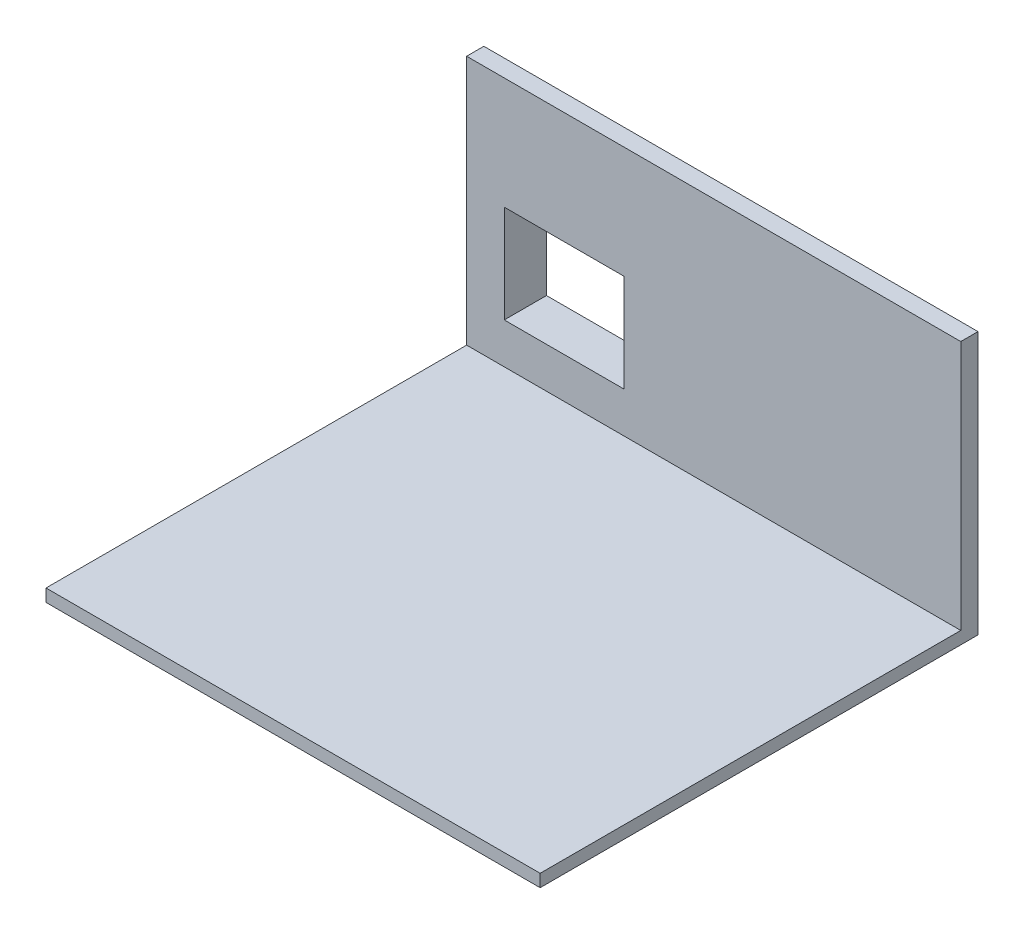
ISO-10303-21;
HEADER;
FILE_DESCRIPTION(('STEP AP214'),'2;1');
FILE_NAME('part.step','',(''),(''),'','','');
FILE_SCHEMA(('AUTOMOTIVE_DESIGN { 1 0 10303 214 1 1 1 1 }'));
ENDSEC;
DATA;
#1=APPLICATION_CONTEXT('core data for automotive mechanical design processes');
#2=APPLICATION_PROTOCOL_DEFINITION('international standard','automotive_design',2000,#1);
#3=PRODUCT_CONTEXT('',#1,'mechanical');
#4=PRODUCT('Part','Part','',(#3));
#5=PRODUCT_RELATED_PRODUCT_CATEGORY('part','',(#4));
#6=PRODUCT_DEFINITION_FORMATION('','',#4);
#7=PRODUCT_DEFINITION_CONTEXT('part definition',#1,'design');
#8=PRODUCT_DEFINITION('design','',#6,#7);
#9=PRODUCT_DEFINITION_SHAPE('','',#8);
#10=(LENGTH_UNIT() NAMED_UNIT(*) SI_UNIT(.MILLI.,.METRE.));
#11=(NAMED_UNIT(*) PLANE_ANGLE_UNIT() SI_UNIT($,.RADIAN.));
#12=(NAMED_UNIT(*) SI_UNIT($,.STERADIAN.) SOLID_ANGLE_UNIT());
#13=UNCERTAINTY_MEASURE_WITH_UNIT(LENGTH_MEASURE(1.E-05),#10,'distance_accuracy_value','');
#14=(GEOMETRIC_REPRESENTATION_CONTEXT(3) GLOBAL_UNCERTAINTY_ASSIGNED_CONTEXT((#13)) GLOBAL_UNIT_ASSIGNED_CONTEXT((#10,
#11,#12)) REPRESENTATION_CONTEXT('',''));
#15=CARTESIAN_POINT('',(0.,0.,0.));
#16=DIRECTION('',(0.,0.,1.));
#17=DIRECTION('',(1.,0.,0.));
#18=AXIS2_PLACEMENT_3D('',#15,#16,#17);
#19=CARTESIAN_POINT('',(0.,2100.,0.));
#20=DIRECTION('',(0.,1.,0.));
#21=DIRECTION('',(0.,0.,1.));
#22=AXIS2_PLACEMENT_3D('',#19,#20,#21);
#23=PLANE('',#22);
#24=DIRECTION('',(0.,0.,1.));
#25=VECTOR('',#24,1.);
#26=CARTESIAN_POINT('',(-6250.,2100.,-1760.86956521739));
#27=LINE('',#26,#25);
#28=CARTESIAN_POINT('',(-6250.,2100.,-1760.86956521739));
#29=VERTEX_POINT('',#28);
#30=CARTESIAN_POINT('',(-6250.,2100.,-1623.17873582494));
#31=VERTEX_POINT('',#30);
#32=EDGE_CURVE('E143',#29,#31,#27,.T.);
#33=ORIENTED_EDGE('',*,*,#32,.T.);
#34=DIRECTION('',(-1.,0.,0.));
#35=VECTOR('',#34,1.);
#36=CARTESIAN_POINT('',(-6250.,2100.,-1623.17873582494));
#37=LINE('',#36,#35);
#38=CARTESIAN_POINT('',(-2300.,2100.,-1623.17873582494));
#39=VERTEX_POINT('',#38);
#40=EDGE_CURVE('E137',#39,#31,#37,.T.);
#41=ORIENTED_EDGE('',*,*,#40,.F.);
#42=DIRECTION('',(0.,0.,1.));
#43=VECTOR('',#42,1.);
#44=CARTESIAN_POINT('',(-2300.,2100.,0.));
#45=LINE('',#44,#43);
#46=CARTESIAN_POINT('',(-2300.,2100.,-1760.86956521739));
#47=VERTEX_POINT('',#46);
#48=EDGE_CURVE('E141',#47,#39,#45,.T.);
#49=ORIENTED_EDGE('',*,*,#48,.F.);
#50=DIRECTION('',(-1.,0.,0.));
#51=VECTOR('',#50,1.);
#52=CARTESIAN_POINT('',(-6250.,2100.,-1760.86956521739));
#53=LINE('',#52,#51);
#54=EDGE_CURVE('E222',#47,#29,#53,.T.);
#55=ORIENTED_EDGE('',*,*,#54,.T.);
#56=EDGE_LOOP('',(#33,#41,#49,#55));
#57=FACE_BOUND('',#56,.T.);
#58=ADVANCED_FACE('F35',(#57),#23,.T.);
#59=CARTESIAN_POINT('',(-6250.,100.,-1760.86956521739));
#60=DIRECTION('',(0.,0.,1.));
#61=DIRECTION('',(1.,0.,0.));
#62=AXIS2_PLACEMENT_3D('',#59,#60,#61);
#63=PLANE('',#62);
#64=DIRECTION('',(-1.,0.,0.));
#65=VECTOR('',#64,1.);
#66=CARTESIAN_POINT('',(-6250.,0.,-1760.86956521739));
#67=LINE('',#66,#65);
#68=CARTESIAN_POINT('',(-2300.,0.,-1760.86956521739));
#69=VERTEX_POINT('',#68);
#70=CARTESIAN_POINT('',(-6250.,0.,-1760.86956521739));
#71=VERTEX_POINT('',#70);
#72=EDGE_CURVE('E228',#69,#71,#67,.T.);
#73=ORIENTED_EDGE('',*,*,#72,.T.);
#74=DIRECTION('',(0.,-1.,0.));
#75=VECTOR('',#74,1.);
#76=CARTESIAN_POINT('',(-6250.,100.,-1760.86956521739));
#77=LINE('',#76,#75);
#78=EDGE_CURVE('E230',#29,#71,#77,.T.);
#79=ORIENTED_EDGE('',*,*,#78,.F.);
#80=ORIENTED_EDGE('',*,*,#54,.F.);
#81=DIRECTION('',(0.,1.,0.));
#82=VECTOR('',#81,1.);
#83=CARTESIAN_POINT('',(-2300.,0.,-1760.86956521739));
#84=LINE('',#83,#82);
#85=EDGE_CURVE('E163',#69,#47,#84,.T.);
#86=ORIENTED_EDGE('',*,*,#85,.F.);
#87=EDGE_LOOP('',(#73,#79,#80,#86));
#88=FACE_BOUND('',#87,.T.);
#89=DIRECTION('',(0.,-1.,0.));
#90=VECTOR('',#89,1.);
#91=CARTESIAN_POINT('',(-4902.7095831107,1295.69578269687,-1760.86956521739));
#92=LINE('',#91,#90);
#93=CARTESIAN_POINT('',(-4902.7095831107,1295.69578269687,-1760.86956521739));
#94=VERTEX_POINT('',#93);
#95=CARTESIAN_POINT('',(-4902.7095831107,334.813684662396,-1760.86956521739));
#96=VERTEX_POINT('',#95);
#97=EDGE_CURVE('E191',#94,#96,#92,.T.);
#98=ORIENTED_EDGE('',*,*,#97,.F.);
#99=DIRECTION('',(1.,0.,0.));
#100=VECTOR('',#99,1.);
#101=CARTESIAN_POINT('',(-4902.7095831107,1295.69578269687,-1760.86956521739));
#102=LINE('',#101,#100);
#103=CARTESIAN_POINT('',(-6039.24135823389,1295.69578269687,-1760.86956521739));
#104=VERTEX_POINT('',#103);
#105=EDGE_CURVE('E196',#104,#94,#102,.T.);
#106=ORIENTED_EDGE('',*,*,#105,.F.);
#107=DIRECTION('',(0.,1.,0.));
#108=VECTOR('',#107,1.);
#109=CARTESIAN_POINT('',(-6039.24135823389,1295.69578269687,-1760.86956521739));
#110=LINE('',#109,#108);
#111=CARTESIAN_POINT('',(-6039.24135823389,334.813684662396,-1760.86956521739));
#112=VERTEX_POINT('',#111);
#113=EDGE_CURVE('E206',#112,#104,#110,.T.);
#114=ORIENTED_EDGE('',*,*,#113,.F.);
#115=DIRECTION('',(-1.,0.,0.));
#116=VECTOR('',#115,1.);
#117=CARTESIAN_POINT('',(-4902.7095831107,334.813684662396,-1760.86956521739));
#118=LINE('',#117,#116);
#119=EDGE_CURVE('E58',#96,#112,#118,.T.);
#120=ORIENTED_EDGE('',*,*,#119,.F.);
#121=EDGE_LOOP('',(#98,#106,#114,#120));
#122=FACE_BOUND('',#121,.T.);
#123=ADVANCED_FACE('F275',(#88,#122),#63,.F.);
#124=CARTESIAN_POINT('',(-6250.,100.,-1760.86956521739));
#125=DIRECTION('',(1.,0.,0.));
#126=DIRECTION('',(0.,0.,-1.));
#127=AXIS2_PLACEMENT_3D('',#124,#125,#126);
#128=PLANE('',#127);
#129=DIRECTION('',(0.,0.,1.));
#130=VECTOR('',#129,1.);
#131=CARTESIAN_POINT('',(-6250.,100.,-1760.86956521739));
#132=LINE('',#131,#130);
#133=CARTESIAN_POINT('',(-6250.,100.,-1623.17873582494));
#134=VERTEX_POINT('',#133);
#135=CARTESIAN_POINT('',(-6250.,100.,1739.13043478261));
#136=VERTEX_POINT('',#135);
#137=EDGE_CURVE('E225',#134,#136,#132,.T.);
#138=ORIENTED_EDGE('',*,*,#137,.F.);
#139=DIRECTION('',(0.,-1.,0.));
#140=VECTOR('',#139,1.);
#141=CARTESIAN_POINT('',(-6250.,2100.,-1623.17873582494));
#142=LINE('',#141,#140);
#143=EDGE_CURVE('E173',#31,#134,#142,.T.);
#144=ORIENTED_EDGE('',*,*,#143,.F.);
#145=ORIENTED_EDGE('',*,*,#32,.F.);
#146=ORIENTED_EDGE('',*,*,#78,.T.);
#147=DIRECTION('',(0.,0.,1.));
#148=VECTOR('',#147,1.);
#149=CARTESIAN_POINT('',(-6250.,0.,-1760.86956521739));
#150=LINE('',#149,#148);
#151=CARTESIAN_POINT('',(-6250.,0.,1739.13043478261));
#152=VERTEX_POINT('',#151);
#153=EDGE_CURVE('E224',#71,#152,#150,.T.);
#154=ORIENTED_EDGE('',*,*,#153,.T.);
#155=DIRECTION('',(0.,-1.,0.));
#156=VECTOR('',#155,1.);
#157=CARTESIAN_POINT('',(-6250.,100.,1739.13043478261));
#158=LINE('',#157,#156);
#159=EDGE_CURVE('E238',#136,#152,#158,.T.);
#160=ORIENTED_EDGE('',*,*,#159,.F.);
#161=EDGE_LOOP('',(#138,#144,#145,#146,#154,#160));
#162=FACE_BOUND('',#161,.T.);
#163=ADVANCED_FACE('F37',(#162),#128,.F.);
#164=CARTESIAN_POINT('',(-6250.,100.,1739.13043478261));
#165=DIRECTION('',(0.,0.,-1.));
#166=DIRECTION('',(-1.,0.,0.));
#167=AXIS2_PLACEMENT_3D('',#164,#165,#166);
#168=PLANE('',#167);
#169=DIRECTION('',(1.,0.,0.));
#170=VECTOR('',#169,1.);
#171=CARTESIAN_POINT('',(-6250.,0.,1739.13043478261));
#172=LINE('',#171,#170);
#173=CARTESIAN_POINT('',(-2300.,0.,1739.13043478261));
#174=VERTEX_POINT('',#173);
#175=EDGE_CURVE('E233',#152,#174,#172,.T.);
#176=ORIENTED_EDGE('',*,*,#175,.T.);
#177=DIRECTION('',(0.,-1.,0.));
#178=VECTOR('',#177,1.);
#179=CARTESIAN_POINT('',(-2300.,0.,1739.13043478261));
#180=LINE('',#179,#178);
#181=CARTESIAN_POINT('',(-2300.,100.,1739.13043478261));
#182=VERTEX_POINT('',#181);
#183=EDGE_CURVE('E167',#182,#174,#180,.T.);
#184=ORIENTED_EDGE('',*,*,#183,.F.);
#185=DIRECTION('',(1.,0.,0.));
#186=VECTOR('',#185,1.);
#187=CARTESIAN_POINT('',(-6250.,100.,1739.13043478261));
#188=LINE('',#187,#186);
#189=EDGE_CURVE('E227',#136,#182,#188,.T.);
#190=ORIENTED_EDGE('',*,*,#189,.F.);
#191=ORIENTED_EDGE('',*,*,#159,.T.);
#192=EDGE_LOOP('',(#176,#184,#190,#191));
#193=FACE_BOUND('',#192,.T.);
#194=ADVANCED_FACE('F291',(#193),#168,.F.);
#195=CARTESIAN_POINT('',(0.,100.,0.));
#196=DIRECTION('',(0.,1.,0.));
#197=DIRECTION('',(0.,0.,1.));
#198=AXIS2_PLACEMENT_3D('',#195,#196,#197);
#199=PLANE('',#198);
#200=ORIENTED_EDGE('',*,*,#189,.T.);
#201=DIRECTION('',(0.,0.,1.));
#202=VECTOR('',#201,1.);
#203=CARTESIAN_POINT('',(-2300.,100.,0.));
#204=LINE('',#203,#202);
#205=CARTESIAN_POINT('',(-2300.,100.,-1623.17873582494));
#206=VERTEX_POINT('',#205);
#207=EDGE_CURVE('E157',#206,#182,#204,.T.);
#208=ORIENTED_EDGE('',*,*,#207,.F.);
#209=DIRECTION('',(1.,0.,0.));
#210=VECTOR('',#209,1.);
#211=CARTESIAN_POINT('',(-6250.,100.,-1623.17873582494));
#212=LINE('',#211,#210);
#213=EDGE_CURVE('E148',#134,#206,#212,.T.);
#214=ORIENTED_EDGE('',*,*,#213,.F.);
#215=ORIENTED_EDGE('',*,*,#137,.T.);
#216=EDGE_LOOP('',(#200,#208,#214,#215));
#217=FACE_BOUND('',#216,.T.);
#218=ADVANCED_FACE('F287',(#217),#199,.T.);
#219=CARTESIAN_POINT('',(0.,0.,0.));
#220=DIRECTION('',(0.,1.,0.));
#221=DIRECTION('',(0.,0.,1.));
#222=AXIS2_PLACEMENT_3D('',#219,#220,#221);
#223=PLANE('',#222);
#224=ORIENTED_EDGE('',*,*,#153,.F.);
#225=ORIENTED_EDGE('',*,*,#72,.F.);
#226=DIRECTION('',(0.,0.,-1.));
#227=VECTOR('',#226,1.);
#228=CARTESIAN_POINT('',(-2300.,0.,0.));
#229=LINE('',#228,#227);
#230=EDGE_CURVE('E170',#174,#69,#229,.T.);
#231=ORIENTED_EDGE('',*,*,#230,.F.);
#232=ORIENTED_EDGE('',*,*,#175,.F.);
#233=EDGE_LOOP('',(#224,#225,#231,#232));
#234=FACE_BOUND('',#233,.T.);
#235=ADVANCED_FACE('F290',(#234),#223,.F.);
#236=CARTESIAN_POINT('',(0.,0.,-1960.86956521739));
#237=DIRECTION('',(0.,0.,-1.));
#238=DIRECTION('',(-1.,0.,0.));
#239=AXIS2_PLACEMENT_3D('',#236,#237,#238);
#240=PLANE('',#239);
#241=DIRECTION('',(0.,-1.,0.));
#242=VECTOR('',#241,1.);
#243=CARTESIAN_POINT('',(-4902.7095831107,1295.69578269687,-1960.86956521739));
#244=LINE('',#243,#242);
#245=CARTESIAN_POINT('',(-4902.7095831107,1295.69578269687,-1960.86956521739));
#246=VERTEX_POINT('',#245);
#247=CARTESIAN_POINT('',(-4902.7095831107,334.813684662396,-1960.86956521739));
#248=VERTEX_POINT('',#247);
#249=EDGE_CURVE('E192',#246,#248,#244,.T.);
#250=ORIENTED_EDGE('',*,*,#249,.T.);
#251=DIRECTION('',(-1.,0.,0.));
#252=VECTOR('',#251,1.);
#253=CARTESIAN_POINT('',(-4902.7095831107,334.813684662396,-1960.86956521739));
#254=LINE('',#253,#252);
#255=CARTESIAN_POINT('',(-6039.24135823389,334.813684662396,-1960.86956521739));
#256=VERTEX_POINT('',#255);
#257=EDGE_CURVE('E195',#248,#256,#254,.T.);
#258=ORIENTED_EDGE('',*,*,#257,.T.);
#259=DIRECTION('',(0.,1.,0.));
#260=VECTOR('',#259,1.);
#261=CARTESIAN_POINT('',(-6039.24135823389,1295.69578269687,-1960.86956521739));
#262=LINE('',#261,#260);
#263=CARTESIAN_POINT('',(-6039.24135823389,1295.69578269687,-1960.86956521739));
#264=VERTEX_POINT('',#263);
#265=EDGE_CURVE('E198',#256,#264,#262,.T.);
#266=ORIENTED_EDGE('',*,*,#265,.T.);
#267=DIRECTION('',(1.,0.,0.));
#268=VECTOR('',#267,1.);
#269=CARTESIAN_POINT('',(-4902.7095831107,1295.69578269687,-1960.86956521739));
#270=LINE('',#269,#268);
#271=EDGE_CURVE('E200',#264,#246,#270,.T.);
#272=ORIENTED_EDGE('',*,*,#271,.T.);
#273=EDGE_LOOP('',(#250,#258,#266,#272));
#274=FACE_BOUND('',#273,.T.);
#275=DIRECTION('',(-1.,0.,0.));
#276=VECTOR('',#275,1.);
#277=CARTESIAN_POINT('',(-4992.7095831107,424.813684662396,-1960.86956521739));
#278=LINE('',#277,#276);
#279=CARTESIAN_POINT('',(-4992.7095831107,424.813684662396,-1960.86956521739));
#280=VERTEX_POINT('',#279);
#281=CARTESIAN_POINT('',(-5949.24135823389,424.813684662396,-1960.86956521739));
#282=VERTEX_POINT('',#281);
#283=EDGE_CURVE('E177',#280,#282,#278,.T.);
#284=ORIENTED_EDGE('',*,*,#283,.F.);
#285=DIRECTION('',(0.,-1.,0.));
#286=VECTOR('',#285,1.);
#287=CARTESIAN_POINT('',(-4992.7095831107,1205.69578269687,-1960.86956521739));
#288=LINE('',#287,#286);
#289=CARTESIAN_POINT('',(-4992.7095831107,1205.69578269687,-1960.86956521739));
#290=VERTEX_POINT('',#289);
#291=EDGE_CURVE('E147',#290,#280,#288,.T.);
#292=ORIENTED_EDGE('',*,*,#291,.F.);
#293=DIRECTION('',(1.,0.,0.));
#294=VECTOR('',#293,1.);
#295=CARTESIAN_POINT('',(-4992.7095831107,1205.69578269687,-1960.86956521739));
#296=LINE('',#295,#294);
#297=CARTESIAN_POINT('',(-5949.24135823389,1205.69578269687,-1960.86956521739));
#298=VERTEX_POINT('',#297);
#299=EDGE_CURVE('E182',#298,#290,#296,.T.);
#300=ORIENTED_EDGE('',*,*,#299,.F.);
#301=DIRECTION('',(0.,1.,0.));
#302=VECTOR('',#301,1.);
#303=CARTESIAN_POINT('',(-5949.24135823389,1205.69578269687,-1960.86956521739));
#304=LINE('',#303,#302);
#305=EDGE_CURVE('E179',#282,#298,#304,.T.);
#306=ORIENTED_EDGE('',*,*,#305,.F.);
#307=EDGE_LOOP('',(#284,#292,#300,#306));
#308=FACE_BOUND('',#307,.T.);
#309=ADVANCED_FACE('F260',(#274,#308),#240,.T.);
#310=CARTESIAN_POINT('',(-4902.7095831107,1295.69578269687,-1960.86956521739));
#311=DIRECTION('',(-1.,0.,0.));
#312=DIRECTION('',(0.,0.,1.));
#313=AXIS2_PLACEMENT_3D('',#310,#311,#312);
#314=PLANE('',#313);
#315=ORIENTED_EDGE('',*,*,#97,.T.);
#316=DIRECTION('',(0.,0.,1.));
#317=VECTOR('',#316,1.);
#318=CARTESIAN_POINT('',(-4902.7095831107,334.813684662396,-1960.86956521739));
#319=LINE('',#318,#317);
#320=EDGE_CURVE('E219',#248,#96,#319,.T.);
#321=ORIENTED_EDGE('',*,*,#320,.F.);
#322=ORIENTED_EDGE('',*,*,#249,.F.);
#323=DIRECTION('',(0.,0.,1.));
#324=VECTOR('',#323,1.);
#325=CARTESIAN_POINT('',(-4902.7095831107,1295.69578269687,-1960.86956521739));
#326=LINE('',#325,#324);
#327=EDGE_CURVE('E202',#246,#94,#326,.T.);
#328=ORIENTED_EDGE('',*,*,#327,.T.);
#329=EDGE_LOOP('',(#315,#321,#322,#328));
#330=FACE_BOUND('',#329,.T.);
#331=ADVANCED_FACE('F285',(#330),#314,.F.);
#332=CARTESIAN_POINT('',(-4902.7095831107,334.813684662396,-1960.86956521739));
#333=DIRECTION('',(0.,1.,0.));
#334=DIRECTION('',(0.,0.,1.));
#335=AXIS2_PLACEMENT_3D('',#332,#333,#334);
#336=PLANE('',#335);
#337=ORIENTED_EDGE('',*,*,#119,.T.);
#338=DIRECTION('',(0.,0.,1.));
#339=VECTOR('',#338,1.);
#340=CARTESIAN_POINT('',(-6039.24135823389,334.813684662396,-1960.86956521739));
#341=LINE('',#340,#339);
#342=EDGE_CURVE('E216',#256,#112,#341,.T.);
#343=ORIENTED_EDGE('',*,*,#342,.F.);
#344=ORIENTED_EDGE('',*,*,#257,.F.);
#345=ORIENTED_EDGE('',*,*,#320,.T.);
#346=EDGE_LOOP('',(#337,#343,#344,#345));
#347=FACE_BOUND('',#346,.T.);
#348=ADVANCED_FACE('F319',(#347),#336,.F.);
#349=CARTESIAN_POINT('',(-6039.24135823389,1295.69578269687,-1960.86956521739));
#350=DIRECTION('',(1.,0.,0.));
#351=DIRECTION('',(0.,0.,-1.));
#352=AXIS2_PLACEMENT_3D('',#349,#350,#351);
#353=PLANE('',#352);
#354=ORIENTED_EDGE('',*,*,#113,.T.);
#355=DIRECTION('',(0.,0.,1.));
#356=VECTOR('',#355,1.);
#357=CARTESIAN_POINT('',(-6039.24135823389,1295.69578269687,-1960.86956521739));
#358=LINE('',#357,#356);
#359=EDGE_CURVE('E213',#264,#104,#358,.T.);
#360=ORIENTED_EDGE('',*,*,#359,.F.);
#361=ORIENTED_EDGE('',*,*,#265,.F.);
#362=ORIENTED_EDGE('',*,*,#342,.T.);
#363=EDGE_LOOP('',(#354,#360,#361,#362));
#364=FACE_BOUND('',#363,.T.);
#365=ADVANCED_FACE('F317',(#364),#353,.F.);
#366=CARTESIAN_POINT('',(-4902.7095831107,1295.69578269687,-1960.86956521739));
#367=DIRECTION('',(0.,-1.,0.));
#368=DIRECTION('',(0.,0.,-1.));
#369=AXIS2_PLACEMENT_3D('',#366,#367,#368);
#370=PLANE('',#369);
#371=ORIENTED_EDGE('',*,*,#105,.T.);
#372=ORIENTED_EDGE('',*,*,#327,.F.);
#373=ORIENTED_EDGE('',*,*,#271,.F.);
#374=ORIENTED_EDGE('',*,*,#359,.T.);
#375=EDGE_LOOP('',(#371,#372,#373,#374));
#376=FACE_BOUND('',#375,.T.);
#377=ADVANCED_FACE('F272',(#376),#370,.F.);
#378=CARTESIAN_POINT('',(-4992.7095831107,1205.69578269687,-1960.86956521739));
#379=DIRECTION('',(-1.,0.,0.));
#380=DIRECTION('',(0.,0.,1.));
#381=AXIS2_PLACEMENT_3D('',#378,#379,#380);
#382=PLANE('',#381);
#383=DIRECTION('',(0.,0.,1.));
#384=VECTOR('',#383,1.);
#385=CARTESIAN_POINT('',(-4992.7095831107,424.813684662396,-1960.86956521739));
#386=LINE('',#385,#384);
#387=CARTESIAN_POINT('',(-4992.7095831107,424.813684662396,-1623.17873582494));
#388=VERTEX_POINT('',#387);
#389=EDGE_CURVE('E189',#280,#388,#386,.T.);
#390=ORIENTED_EDGE('',*,*,#389,.T.);
#391=DIRECTION('',(0.,1.,0.));
#392=VECTOR('',#391,1.);
#393=CARTESIAN_POINT('',(-4992.7095831107,0.,-1623.17873582494));
#394=LINE('',#393,#392);
#395=CARTESIAN_POINT('',(-4992.7095831107,1205.69578269687,-1623.17873582494));
#396=VERTEX_POINT('',#395);
#397=EDGE_CURVE('E11',#388,#396,#394,.T.);
#398=ORIENTED_EDGE('',*,*,#397,.T.);
#399=DIRECTION('',(0.,0.,1.));
#400=VECTOR('',#399,1.);
#401=CARTESIAN_POINT('',(-4992.7095831107,1205.69578269687,-1960.86956521739));
#402=LINE('',#401,#400);
#403=EDGE_CURVE('E184',#290,#396,#402,.T.);
#404=ORIENTED_EDGE('',*,*,#403,.F.);
#405=ORIENTED_EDGE('',*,*,#291,.T.);
#406=EDGE_LOOP('',(#390,#398,#404,#405));
#407=FACE_BOUND('',#406,.T.);
#408=ADVANCED_FACE('F262',(#407),#382,.T.);
#409=CARTESIAN_POINT('',(-4992.7095831107,424.813684662396,-1960.86956521739));
#410=DIRECTION('',(0.,1.,0.));
#411=DIRECTION('',(0.,0.,1.));
#412=AXIS2_PLACEMENT_3D('',#409,#410,#411);
#413=PLANE('',#412);
#414=DIRECTION('',(0.,0.,1.));
#415=VECTOR('',#414,1.);
#416=CARTESIAN_POINT('',(-5949.24135823389,424.813684662396,-1960.86956521739));
#417=LINE('',#416,#415);
#418=CARTESIAN_POINT('',(-5949.24135823389,424.813684662396,-1623.17873582494));
#419=VERTEX_POINT('',#418);
#420=EDGE_CURVE('E50',#282,#419,#417,.T.);
#421=ORIENTED_EDGE('',*,*,#420,.T.);
#422=DIRECTION('',(1.,0.,0.));
#423=VECTOR('',#422,1.);
#424=CARTESIAN_POINT('',(0.,424.813684662396,-1623.17873582494));
#425=LINE('',#424,#423);
#426=EDGE_CURVE('E241',#419,#388,#425,.T.);
#427=ORIENTED_EDGE('',*,*,#426,.T.);
#428=ORIENTED_EDGE('',*,*,#389,.F.);
#429=ORIENTED_EDGE('',*,*,#283,.T.);
#430=EDGE_LOOP('',(#421,#427,#428,#429));
#431=FACE_BOUND('',#430,.T.);
#432=ADVANCED_FACE('F264',(#431),#413,.T.);
#433=CARTESIAN_POINT('',(-5949.24135823389,1205.69578269687,-1960.86956521739));
#434=DIRECTION('',(1.,0.,0.));
#435=DIRECTION('',(0.,0.,-1.));
#436=AXIS2_PLACEMENT_3D('',#433,#434,#435);
#437=PLANE('',#436);
#438=DIRECTION('',(0.,0.,1.));
#439=VECTOR('',#438,1.);
#440=CARTESIAN_POINT('',(-5949.24135823389,1205.69578269687,-1960.86956521739));
#441=LINE('',#440,#439);
#442=CARTESIAN_POINT('',(-5949.24135823389,1205.69578269687,-1623.17873582494));
#443=VERTEX_POINT('',#442);
#444=EDGE_CURVE('E186',#298,#443,#441,.T.);
#445=ORIENTED_EDGE('',*,*,#444,.T.);
#446=DIRECTION('',(0.,-1.,0.));
#447=VECTOR('',#446,1.);
#448=CARTESIAN_POINT('',(-5949.24135823389,0.,-1623.17873582494));
#449=LINE('',#448,#447);
#450=EDGE_CURVE('E243',#443,#419,#449,.T.);
#451=ORIENTED_EDGE('',*,*,#450,.T.);
#452=ORIENTED_EDGE('',*,*,#420,.F.);
#453=ORIENTED_EDGE('',*,*,#305,.T.);
#454=EDGE_LOOP('',(#445,#451,#452,#453));
#455=FACE_BOUND('',#454,.T.);
#456=ADVANCED_FACE('F254',(#455),#437,.T.);
#457=CARTESIAN_POINT('',(-4992.7095831107,1205.69578269687,-1960.86956521739));
#458=DIRECTION('',(0.,-1.,0.));
#459=DIRECTION('',(0.,0.,-1.));
#460=AXIS2_PLACEMENT_3D('',#457,#458,#459);
#461=PLANE('',#460);
#462=ORIENTED_EDGE('',*,*,#403,.T.);
#463=DIRECTION('',(-1.,0.,0.));
#464=VECTOR('',#463,1.);
#465=CARTESIAN_POINT('',(0.,1205.69578269687,-1623.17873582494));
#466=LINE('',#465,#464);
#467=EDGE_CURVE('E43',#396,#443,#466,.T.);
#468=ORIENTED_EDGE('',*,*,#467,.T.);
#469=ORIENTED_EDGE('',*,*,#444,.F.);
#470=ORIENTED_EDGE('',*,*,#299,.T.);
#471=EDGE_LOOP('',(#462,#468,#469,#470));
#472=FACE_BOUND('',#471,.T.);
#473=ADVANCED_FACE('F248',(#472),#461,.T.);
#474=CARTESIAN_POINT('',(0.,0.,-1623.17873582494));
#475=DIRECTION('',(0.,0.,1.));
#476=DIRECTION('',(1.,0.,0.));
#477=AXIS2_PLACEMENT_3D('',#474,#475,#476);
#478=PLANE('',#477);
#479=ORIENTED_EDGE('',*,*,#397,.F.);
#480=ORIENTED_EDGE('',*,*,#426,.F.);
#481=ORIENTED_EDGE('',*,*,#450,.F.);
#482=ORIENTED_EDGE('',*,*,#467,.F.);
#483=EDGE_LOOP('',(#479,#480,#481,#482));
#484=FACE_BOUND('',#483,.T.);
#485=ORIENTED_EDGE('',*,*,#143,.T.);
#486=ORIENTED_EDGE('',*,*,#213,.T.);
#487=DIRECTION('',(0.,-1.,0.));
#488=VECTOR('',#487,1.);
#489=CARTESIAN_POINT('',(-2300.,0.,-1623.17873582494));
#490=LINE('',#489,#488);
#491=EDGE_CURVE('E151',#39,#206,#490,.T.);
#492=ORIENTED_EDGE('',*,*,#491,.F.);
#493=ORIENTED_EDGE('',*,*,#40,.T.);
#494=EDGE_LOOP('',(#485,#486,#492,#493));
#495=FACE_BOUND('',#494,.T.);
#496=ADVANCED_FACE('F152',(#484,#495),#478,.T.);
#497=CARTESIAN_POINT('',(-2300.,0.,0.));
#498=DIRECTION('',(1.,0.,0.));
#499=DIRECTION('',(0.,0.,-1.));
#500=AXIS2_PLACEMENT_3D('',#497,#498,#499);
#501=PLANE('',#500);
#502=ORIENTED_EDGE('',*,*,#48,.T.);
#503=ORIENTED_EDGE('',*,*,#491,.T.);
#504=ORIENTED_EDGE('',*,*,#207,.T.);
#505=ORIENTED_EDGE('',*,*,#183,.T.);
#506=ORIENTED_EDGE('',*,*,#230,.T.);
#507=ORIENTED_EDGE('',*,*,#85,.T.);
#508=EDGE_LOOP('',(#502,#503,#504,#505,#506,#507));
#509=FACE_BOUND('',#508,.T.);
#510=ADVANCED_FACE('F160',(#509),#501,.T.);
#511=CLOSED_SHELL('',(#58,#123,#163,#194,#218,#235,#309,#331,#348,#365,#377,#408,#432,#456,#473,
#496,#510));
#512=MANIFOLD_SOLID_BREP('B2',#511);
#513=ADVANCED_BREP_SHAPE_REPRESENTATION('',(#18,#512),#14);
#514=SHAPE_DEFINITION_REPRESENTATION(#9,#513);
ENDSEC;
END-ISO-10303-21;
